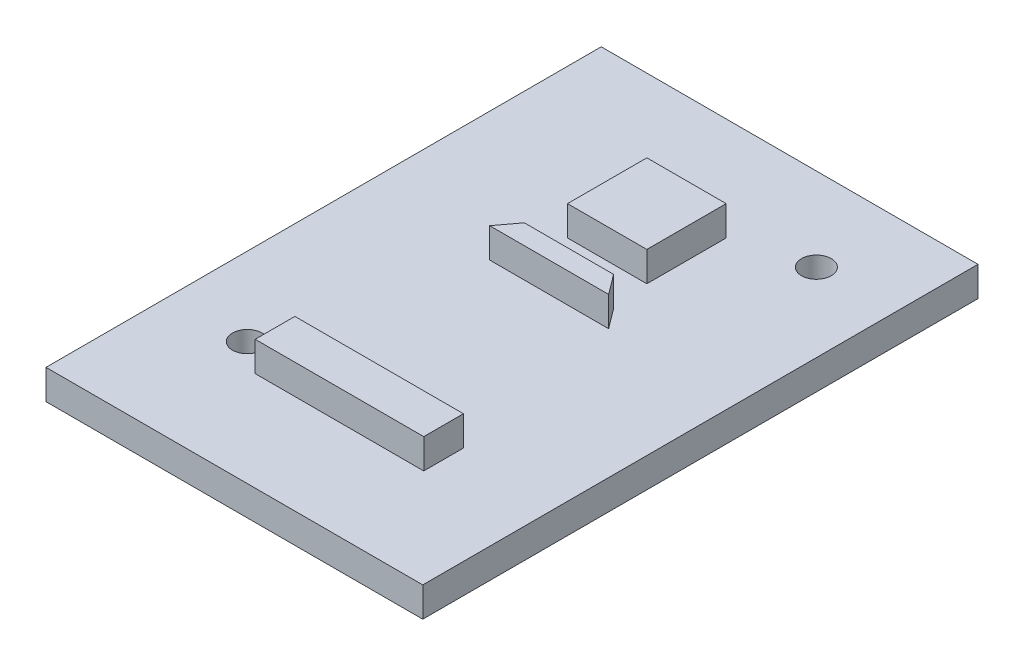
ISO-10303-21;
HEADER;
FILE_DESCRIPTION(('STEP AP214'),'2;1');
FILE_NAME('part.step','',(''),(''),'','','');
FILE_SCHEMA(('AUTOMOTIVE_DESIGN { 1 0 10303 214 1 1 1 1 }'));
ENDSEC;
DATA;
#1=APPLICATION_CONTEXT('core data for automotive mechanical design processes');
#2=APPLICATION_PROTOCOL_DEFINITION('international standard','automotive_design',2000,#1);
#3=PRODUCT_CONTEXT('',#1,'mechanical');
#4=PRODUCT('Part','Part','',(#3));
#5=PRODUCT_RELATED_PRODUCT_CATEGORY('part','',(#4));
#6=PRODUCT_DEFINITION_FORMATION('','',#4);
#7=PRODUCT_DEFINITION_CONTEXT('part definition',#1,'design');
#8=PRODUCT_DEFINITION('design','',#6,#7);
#9=PRODUCT_DEFINITION_SHAPE('','',#8);
#10=(LENGTH_UNIT() NAMED_UNIT(*) SI_UNIT(.MILLI.,.METRE.));
#11=(NAMED_UNIT(*) PLANE_ANGLE_UNIT() SI_UNIT($,.RADIAN.));
#12=(NAMED_UNIT(*) SI_UNIT($,.STERADIAN.) SOLID_ANGLE_UNIT());
#13=UNCERTAINTY_MEASURE_WITH_UNIT(LENGTH_MEASURE(1.E-05),#10,'distance_accuracy_value','');
#14=(GEOMETRIC_REPRESENTATION_CONTEXT(3) GLOBAL_UNCERTAINTY_ASSIGNED_CONTEXT((#13)) GLOBAL_UNIT_ASSIGNED_CONTEXT((#10,
#11,#12)) REPRESENTATION_CONTEXT('',''));
#15=CARTESIAN_POINT('',(0.,0.,0.));
#16=DIRECTION('',(0.,0.,1.));
#17=DIRECTION('',(1.,0.,0.));
#18=AXIS2_PLACEMENT_3D('',#15,#16,#17);
#19=CARTESIAN_POINT('',(0.,1.5,0.));
#20=DIRECTION('',(0.,-1.,0.));
#21=DIRECTION('',(0.,0.,-1.));
#22=AXIS2_PLACEMENT_3D('',#19,#20,#21);
#23=PLANE('',#22);
#24=DIRECTION('',(1.,0.,0.));
#25=VECTOR('',#24,1.);
#26=CARTESIAN_POINT('',(0.,1.5,0.));
#27=LINE('',#26,#25);
#28=CARTESIAN_POINT('',(2.8,1.5,0.));
#29=VERTEX_POINT('',#28);
#30=CARTESIAN_POINT('',(11.3,1.5,0.));
#31=VERTEX_POINT('',#30);
#32=EDGE_CURVE('E175',#29,#31,#27,.T.);
#33=ORIENTED_EDGE('',*,*,#32,.F.);
#34=DIRECTION('',(0.,0.,1.));
#35=VECTOR('',#34,1.);
#36=CARTESIAN_POINT('',(2.8,1.5,0.));
#37=LINE('',#36,#35);
#38=CARTESIAN_POINT('',(2.8,1.5,-2.));
#39=VERTEX_POINT('',#38);
#40=EDGE_CURVE('E47',#39,#29,#37,.T.);
#41=ORIENTED_EDGE('',*,*,#40,.F.);
#42=DIRECTION('',(-1.,0.,0.));
#43=VECTOR('',#42,1.);
#44=CARTESIAN_POINT('',(2.8,1.5,-2.));
#45=LINE('',#44,#43);
#46=CARTESIAN_POINT('',(11.3,1.5,-2.));
#47=VERTEX_POINT('',#46);
#48=EDGE_CURVE('E51',#47,#39,#45,.T.);
#49=ORIENTED_EDGE('',*,*,#48,.F.);
#50=DIRECTION('',(0.,0.,-1.));
#51=VECTOR('',#50,1.);
#52=CARTESIAN_POINT('',(11.3,1.5,0.));
#53=LINE('',#52,#51);
#54=EDGE_CURVE('E199',#31,#47,#53,.T.);
#55=ORIENTED_EDGE('',*,*,#54,.F.);
#56=EDGE_LOOP('',(#33,#41,#49,#55));
#57=FACE_BOUND('',#56,.T.);
#58=DIRECTION('',(-0.6,0.,0.8));
#59=VECTOR('',#58,1.);
#60=CARTESIAN_POINT('',(4.5,1.5,-11.8731868600742));
#61=LINE('',#60,#59);
#62=CARTESIAN_POINT('',(4.5,1.5,-11.8731868600742));
#63=VERTEX_POINT('',#62);
#64=CARTESIAN_POINT('',(3.75,1.5,-10.8731868600742));
#65=VERTEX_POINT('',#64);
#66=EDGE_CURVE('E223',#63,#65,#61,.T.);
#67=ORIENTED_EDGE('',*,*,#66,.F.);
#68=DIRECTION('',(-1.,0.,0.));
#69=VECTOR('',#68,1.);
#70=CARTESIAN_POINT('',(4.5,1.5,-11.8731868600742));
#71=LINE('',#70,#69);
#72=CARTESIAN_POINT('',(9.,1.5,-11.8731868600742));
#73=VERTEX_POINT('',#72);
#74=EDGE_CURVE('E230',#73,#63,#71,.T.);
#75=ORIENTED_EDGE('',*,*,#74,.F.);
#76=DIRECTION('',(-0.6,0.,-0.8));
#77=VECTOR('',#76,1.);
#78=CARTESIAN_POINT('',(9.,1.5,-11.8731868600742));
#79=LINE('',#78,#77);
#80=CARTESIAN_POINT('',(9.75,1.5,-10.8731868600742));
#81=VERTEX_POINT('',#80);
#82=EDGE_CURVE('E242',#81,#73,#79,.T.);
#83=ORIENTED_EDGE('',*,*,#82,.F.);
#84=DIRECTION('',(1.,0.,0.));
#85=VECTOR('',#84,1.);
#86=CARTESIAN_POINT('',(3.75,1.5,-10.8731868600742));
#87=LINE('',#86,#85);
#88=EDGE_CURVE('E239',#65,#81,#87,.T.);
#89=ORIENTED_EDGE('',*,*,#88,.F.);
#90=EDGE_LOOP('',(#67,#75,#83,#89));
#91=FACE_BOUND('',#90,.T.);
#92=DIRECTION('',(0.,0.,1.));
#93=VECTOR('',#92,1.);
#94=CARTESIAN_POINT('',(4.75,1.5,-17.8));
#95=LINE('',#94,#93);
#96=CARTESIAN_POINT('',(4.75,1.5,-17.8));
#97=VERTEX_POINT('',#96);
#98=CARTESIAN_POINT('',(4.75,1.5,-13.8));
#99=VERTEX_POINT('',#98);
#100=EDGE_CURVE('E258',#97,#99,#95,.T.);
#101=ORIENTED_EDGE('',*,*,#100,.F.);
#102=DIRECTION('',(-1.,0.,0.));
#103=VECTOR('',#102,1.);
#104=CARTESIAN_POINT('',(4.75,1.5,-17.8));
#105=LINE('',#104,#103);
#106=CARTESIAN_POINT('',(8.75,1.5,-17.8));
#107=VERTEX_POINT('',#106);
#108=EDGE_CURVE('E263',#107,#97,#105,.T.);
#109=ORIENTED_EDGE('',*,*,#108,.F.);
#110=DIRECTION('',(0.,0.,-1.));
#111=VECTOR('',#110,1.);
#112=CARTESIAN_POINT('',(8.75,1.5,-17.8));
#113=LINE('',#112,#111);
#114=CARTESIAN_POINT('',(8.75,1.5,-13.8));
#115=VERTEX_POINT('',#114);
#116=EDGE_CURVE('E275',#115,#107,#113,.T.);
#117=ORIENTED_EDGE('',*,*,#116,.F.);
#118=DIRECTION('',(1.,0.,0.));
#119=VECTOR('',#118,1.);
#120=CARTESIAN_POINT('',(4.75,1.5,-13.8));
#121=LINE('',#120,#119);
#122=EDGE_CURVE('E272',#99,#115,#121,.T.);
#123=ORIENTED_EDGE('',*,*,#122,.F.);
#124=EDGE_LOOP('',(#101,#109,#117,#123));
#125=FACE_BOUND('',#124,.T.);
#126=CARTESIAN_POINT('',(12.3,1.5,-18.8));
#127=DIRECTION('',(0.,-1.,0.));
#128=DIRECTION('',(0.,0.,-1.));
#129=AXIS2_PLACEMENT_3D('',#126,#127,#128);
#130=CIRCLE('',#129,0.75);
#131=CARTESIAN_POINT('',(12.3,1.5,-19.55));
#132=VERTEX_POINT('',#131);
#133=EDGE_CURVE('E220',#132,#132,#130,.T.);
#134=ORIENTED_EDGE('',*,*,#133,.T.);
#135=EDGE_LOOP('',(#134));
#136=FACE_BOUND('',#135,.T.);
#137=CARTESIAN_POINT('',(1.2,1.5,-1.2));
#138=DIRECTION('',(0.,-1.,0.));
#139=DIRECTION('',(0.,0.,-1.));
#140=AXIS2_PLACEMENT_3D('',#137,#138,#139);
#141=CIRCLE('',#140,0.75);
#142=CARTESIAN_POINT('',(1.2,1.5,-1.95));
#143=VERTEX_POINT('',#142);
#144=EDGE_CURVE('E214',#143,#143,#141,.T.);
#145=ORIENTED_EDGE('',*,*,#144,.T.);
#146=EDGE_LOOP('',(#145));
#147=FACE_BOUND('',#146,.T.);
#148=DIRECTION('',(0.,0.,1.));
#149=VECTOR('',#148,1.);
#150=CARTESIAN_POINT('',(-2.75,1.5,-23.));
#151=LINE('',#150,#149);
#152=CARTESIAN_POINT('',(-2.75,1.5,-23.));
#153=VERTEX_POINT('',#152);
#154=CARTESIAN_POINT('',(-2.75,1.5,5.));
#155=VERTEX_POINT('',#154);
#156=EDGE_CURVE('E179',#153,#155,#151,.T.);
#157=ORIENTED_EDGE('',*,*,#156,.T.);
#158=DIRECTION('',(1.,0.,0.));
#159=VECTOR('',#158,1.);
#160=CARTESIAN_POINT('',(-2.75,1.5,5.));
#161=LINE('',#160,#159);
#162=CARTESIAN_POINT('',(16.25,1.5,5.));
#163=VERTEX_POINT('',#162);
#164=EDGE_CURVE('E149',#155,#163,#161,.T.);
#165=ORIENTED_EDGE('',*,*,#164,.T.);
#166=DIRECTION('',(0.,0.,-1.));
#167=VECTOR('',#166,1.);
#168=CARTESIAN_POINT('',(16.25,1.5,-23.));
#169=LINE('',#168,#167);
#170=CARTESIAN_POINT('',(16.25,1.5,-23.));
#171=VERTEX_POINT('',#170);
#172=EDGE_CURVE('E172',#163,#171,#169,.T.);
#173=ORIENTED_EDGE('',*,*,#172,.T.);
#174=DIRECTION('',(-1.,0.,0.));
#175=VECTOR('',#174,1.);
#176=CARTESIAN_POINT('',(-2.75,1.5,-23.));
#177=LINE('',#176,#175);
#178=EDGE_CURVE('E169',#171,#153,#177,.T.);
#179=ORIENTED_EDGE('',*,*,#178,.T.);
#180=EDGE_LOOP('',(#157,#165,#173,#179));
#181=FACE_BOUND('',#180,.T.);
#182=ADVANCED_FACE('F32',(#57,#91,#125,#136,#147,#181),#23,.F.);
#183=CARTESIAN_POINT('',(0.,1.5,0.));
#184=DIRECTION('',(0.,0.,-1.));
#185=DIRECTION('',(-1.,0.,0.));
#186=AXIS2_PLACEMENT_3D('',#183,#184,#185);
#187=PLANE('',#186);
#188=DIRECTION('',(0.,-1.,0.));
#189=VECTOR('',#188,1.);
#190=CARTESIAN_POINT('',(2.8,3.,0.));
#191=LINE('',#190,#189);
#192=CARTESIAN_POINT('',(2.8,3.,0.));
#193=VERTEX_POINT('',#192);
#194=EDGE_CURVE('E210',#193,#29,#191,.T.);
#195=ORIENTED_EDGE('',*,*,#194,.T.);
#196=ORIENTED_EDGE('',*,*,#32,.T.);
#197=DIRECTION('',(0.,-1.,0.));
#198=VECTOR('',#197,1.);
#199=CARTESIAN_POINT('',(11.3,3.,0.));
#200=LINE('',#199,#198);
#201=CARTESIAN_POINT('',(11.3,3.,0.));
#202=VERTEX_POINT('',#201);
#203=EDGE_CURVE('E207',#202,#31,#200,.T.);
#204=ORIENTED_EDGE('',*,*,#203,.F.);
#205=DIRECTION('',(1.,0.,0.));
#206=VECTOR('',#205,1.);
#207=CARTESIAN_POINT('',(2.8,3.,0.));
#208=LINE('',#207,#206);
#209=EDGE_CURVE('E191',#193,#202,#208,.T.);
#210=ORIENTED_EDGE('',*,*,#209,.F.);
#211=EDGE_LOOP('',(#195,#196,#204,#210));
#212=FACE_BOUND('',#211,.T.);
#213=ADVANCED_FACE('F34',(#212),#187,.F.);
#214=CARTESIAN_POINT('',(0.,0.,0.));
#215=DIRECTION('',(0.,-1.,0.));
#216=DIRECTION('',(0.,0.,-1.));
#217=AXIS2_PLACEMENT_3D('',#214,#215,#216);
#218=PLANE('',#217);
#219=CARTESIAN_POINT('',(1.2,0.,-1.2));
#220=DIRECTION('',(0.,-1.,0.));
#221=DIRECTION('',(0.,0.,-1.));
#222=AXIS2_PLACEMENT_3D('',#219,#220,#221);
#223=CIRCLE('',#222,0.75);
#224=CARTESIAN_POINT('',(1.2,0.,-1.95));
#225=VERTEX_POINT('',#224);
#226=EDGE_CURVE('E213',#225,#225,#223,.T.);
#227=ORIENTED_EDGE('',*,*,#226,.F.);
#228=EDGE_LOOP('',(#227));
#229=FACE_BOUND('',#228,.T.);
#230=CARTESIAN_POINT('',(12.3,0.,-18.8));
#231=DIRECTION('',(0.,-1.,0.));
#232=DIRECTION('',(0.,0.,-1.));
#233=AXIS2_PLACEMENT_3D('',#230,#231,#232);
#234=CIRCLE('',#233,0.75);
#235=CARTESIAN_POINT('',(12.3,0.,-19.55));
#236=VERTEX_POINT('',#235);
#237=EDGE_CURVE('E217',#236,#236,#234,.T.);
#238=ORIENTED_EDGE('',*,*,#237,.F.);
#239=EDGE_LOOP('',(#238));
#240=FACE_BOUND('',#239,.T.);
#241=DIRECTION('',(0.,0.,1.));
#242=VECTOR('',#241,1.);
#243=CARTESIAN_POINT('',(-2.75,0.,-23.));
#244=LINE('',#243,#242);
#245=CARTESIAN_POINT('',(-2.75,0.,-23.));
#246=VERTEX_POINT('',#245);
#247=CARTESIAN_POINT('',(-2.75,0.,5.));
#248=VERTEX_POINT('',#247);
#249=EDGE_CURVE('E162',#246,#248,#244,.T.);
#250=ORIENTED_EDGE('',*,*,#249,.F.);
#251=DIRECTION('',(-1.,0.,0.));
#252=VECTOR('',#251,1.);
#253=CARTESIAN_POINT('',(-2.75,0.,-23.));
#254=LINE('',#253,#252);
#255=CARTESIAN_POINT('',(16.25,0.,-23.));
#256=VERTEX_POINT('',#255);
#257=EDGE_CURVE('E155',#256,#246,#254,.T.);
#258=ORIENTED_EDGE('',*,*,#257,.F.);
#259=DIRECTION('',(0.,0.,-1.));
#260=VECTOR('',#259,1.);
#261=CARTESIAN_POINT('',(16.25,0.,-23.));
#262=LINE('',#261,#260);
#263=CARTESIAN_POINT('',(16.25,0.,5.));
#264=VERTEX_POINT('',#263);
#265=EDGE_CURVE('E165',#264,#256,#262,.T.);
#266=ORIENTED_EDGE('',*,*,#265,.F.);
#267=DIRECTION('',(1.,0.,0.));
#268=VECTOR('',#267,1.);
#269=CARTESIAN_POINT('',(-2.75,0.,5.));
#270=LINE('',#269,#268);
#271=EDGE_CURVE('E147',#248,#264,#270,.T.);
#272=ORIENTED_EDGE('',*,*,#271,.F.);
#273=EDGE_LOOP('',(#250,#258,#266,#272));
#274=FACE_BOUND('',#273,.T.);
#275=ADVANCED_FACE('F160',(#229,#240,#274),#218,.T.);
#276=CARTESIAN_POINT('',(4.75,3.,-17.8));
#277=DIRECTION('',(1.,0.,0.));
#278=DIRECTION('',(0.,0.,-1.));
#279=AXIS2_PLACEMENT_3D('',#276,#277,#278);
#280=PLANE('',#279);
#281=ORIENTED_EDGE('',*,*,#100,.T.);
#282=DIRECTION('',(0.,-1.,0.));
#283=VECTOR('',#282,1.);
#284=CARTESIAN_POINT('',(4.75,3.,-13.8));
#285=LINE('',#284,#283);
#286=CARTESIAN_POINT('',(4.75,3.,-13.8));
#287=VERTEX_POINT('',#286);
#288=EDGE_CURVE('E11',#287,#99,#285,.T.);
#289=ORIENTED_EDGE('',*,*,#288,.F.);
#290=DIRECTION('',(0.,0.,1.));
#291=VECTOR('',#290,1.);
#292=CARTESIAN_POINT('',(4.75,3.,-17.8));
#293=LINE('',#292,#291);
#294=CARTESIAN_POINT('',(4.75,3.,-17.8));
#295=VERTEX_POINT('',#294);
#296=EDGE_CURVE('E259',#295,#287,#293,.T.);
#297=ORIENTED_EDGE('',*,*,#296,.F.);
#298=DIRECTION('',(0.,-1.,0.));
#299=VECTOR('',#298,1.);
#300=CARTESIAN_POINT('',(4.75,3.,-17.8));
#301=LINE('',#300,#299);
#302=EDGE_CURVE('E269',#295,#97,#301,.T.);
#303=ORIENTED_EDGE('',*,*,#302,.T.);
#304=EDGE_LOOP('',(#281,#289,#297,#303));
#305=FACE_BOUND('',#304,.T.);
#306=ADVANCED_FACE('F301',(#305),#280,.F.);
#307=CARTESIAN_POINT('',(4.75,3.,-13.8));
#308=DIRECTION('',(0.,0.,-1.));
#309=DIRECTION('',(-1.,0.,0.));
#310=AXIS2_PLACEMENT_3D('',#307,#308,#309);
#311=PLANE('',#310);
#312=ORIENTED_EDGE('',*,*,#122,.T.);
#313=DIRECTION('',(0.,-1.,0.));
#314=VECTOR('',#313,1.);
#315=CARTESIAN_POINT('',(8.75,3.,-13.8));
#316=LINE('',#315,#314);
#317=CARTESIAN_POINT('',(8.75,3.,-13.8));
#318=VERTEX_POINT('',#317);
#319=EDGE_CURVE('E40',#318,#115,#316,.T.);
#320=ORIENTED_EDGE('',*,*,#319,.F.);
#321=DIRECTION('',(1.,0.,0.));
#322=VECTOR('',#321,1.);
#323=CARTESIAN_POINT('',(4.75,3.,-13.8));
#324=LINE('',#323,#322);
#325=EDGE_CURVE('E262',#287,#318,#324,.T.);
#326=ORIENTED_EDGE('',*,*,#325,.F.);
#327=ORIENTED_EDGE('',*,*,#288,.T.);
#328=EDGE_LOOP('',(#312,#320,#326,#327));
#329=FACE_BOUND('',#328,.T.);
#330=ADVANCED_FACE('F291',(#329),#311,.F.);
#331=CARTESIAN_POINT('',(8.75,3.,-17.8));
#332=DIRECTION('',(-1.,0.,0.));
#333=DIRECTION('',(0.,0.,1.));
#334=AXIS2_PLACEMENT_3D('',#331,#332,#333);
#335=PLANE('',#334);
#336=ORIENTED_EDGE('',*,*,#116,.T.);
#337=DIRECTION('',(0.,-1.,0.));
#338=VECTOR('',#337,1.);
#339=CARTESIAN_POINT('',(8.75,3.,-17.8));
#340=LINE('',#339,#338);
#341=CARTESIAN_POINT('',(8.75,3.,-17.8));
#342=VERTEX_POINT('',#341);
#343=EDGE_CURVE('E282',#342,#107,#340,.T.);
#344=ORIENTED_EDGE('',*,*,#343,.F.);
#345=DIRECTION('',(0.,0.,-1.));
#346=VECTOR('',#345,1.);
#347=CARTESIAN_POINT('',(8.75,3.,-17.8));
#348=LINE('',#347,#346);
#349=EDGE_CURVE('E265',#318,#342,#348,.T.);
#350=ORIENTED_EDGE('',*,*,#349,.F.);
#351=ORIENTED_EDGE('',*,*,#319,.T.);
#352=EDGE_LOOP('',(#336,#344,#350,#351));
#353=FACE_BOUND('',#352,.T.);
#354=ADVANCED_FACE('F288',(#353),#335,.F.);
#355=CARTESIAN_POINT('',(4.75,3.,-17.8));
#356=DIRECTION('',(0.,0.,1.));
#357=DIRECTION('',(1.,0.,0.));
#358=AXIS2_PLACEMENT_3D('',#355,#356,#357);
#359=PLANE('',#358);
#360=ORIENTED_EDGE('',*,*,#108,.T.);
#361=ORIENTED_EDGE('',*,*,#302,.F.);
#362=DIRECTION('',(-1.,0.,0.));
#363=VECTOR('',#362,1.);
#364=CARTESIAN_POINT('',(4.75,3.,-17.8));
#365=LINE('',#364,#363);
#366=EDGE_CURVE('E267',#342,#295,#365,.T.);
#367=ORIENTED_EDGE('',*,*,#366,.F.);
#368=ORIENTED_EDGE('',*,*,#343,.T.);
#369=EDGE_LOOP('',(#360,#361,#367,#368));
#370=FACE_BOUND('',#369,.T.);
#371=ADVANCED_FACE('F297',(#370),#359,.F.);
#372=CARTESIAN_POINT('',(0.,3.,0.));
#373=DIRECTION('',(0.,1.,0.));
#374=DIRECTION('',(0.,0.,1.));
#375=AXIS2_PLACEMENT_3D('',#372,#373,#374);
#376=PLANE('',#375);
#377=ORIENTED_EDGE('',*,*,#296,.T.);
#378=ORIENTED_EDGE('',*,*,#325,.T.);
#379=ORIENTED_EDGE('',*,*,#349,.T.);
#380=ORIENTED_EDGE('',*,*,#366,.T.);
#381=EDGE_LOOP('',(#377,#378,#379,#380));
#382=FACE_BOUND('',#381,.T.);
#383=ADVANCED_FACE('F303',(#382),#376,.T.);
#384=CARTESIAN_POINT('',(4.5,3.,-11.8731868600742));
#385=DIRECTION('',(0.8,0.,0.6));
#386=DIRECTION('',(0.6,0.,-0.8));
#387=AXIS2_PLACEMENT_3D('',#384,#385,#386);
#388=PLANE('',#387);
#389=ORIENTED_EDGE('',*,*,#66,.T.);
#390=DIRECTION('',(0.,-1.,0.));
#391=VECTOR('',#390,1.);
#392=CARTESIAN_POINT('',(3.75,3.,-10.8731868600742));
#393=LINE('',#392,#391);
#394=CARTESIAN_POINT('',(3.75,3.,-10.8731868600742));
#395=VERTEX_POINT('',#394);
#396=EDGE_CURVE('E255',#395,#65,#393,.T.);
#397=ORIENTED_EDGE('',*,*,#396,.F.);
#398=DIRECTION('',(-0.6,0.,0.8));
#399=VECTOR('',#398,1.);
#400=CARTESIAN_POINT('',(4.5,3.,-11.8731868600742));
#401=LINE('',#400,#399);
#402=CARTESIAN_POINT('',(4.5,3.,-11.8731868600742));
#403=VERTEX_POINT('',#402);
#404=EDGE_CURVE('E226',#403,#395,#401,.T.);
#405=ORIENTED_EDGE('',*,*,#404,.F.);
#406=DIRECTION('',(0.,-1.,0.));
#407=VECTOR('',#406,1.);
#408=CARTESIAN_POINT('',(4.5,3.,-11.8731868600742));
#409=LINE('',#408,#407);
#410=EDGE_CURVE('E236',#403,#63,#409,.T.);
#411=ORIENTED_EDGE('',*,*,#410,.T.);
#412=EDGE_LOOP('',(#389,#397,#405,#411));
#413=FACE_BOUND('',#412,.T.);
#414=ADVANCED_FACE('F305',(#413),#388,.F.);
#415=CARTESIAN_POINT('',(3.75,3.,-10.8731868600742));
#416=DIRECTION('',(0.,0.,-1.));
#417=DIRECTION('',(-1.,0.,0.));
#418=AXIS2_PLACEMENT_3D('',#415,#416,#417);
#419=PLANE('',#418);
#420=ORIENTED_EDGE('',*,*,#88,.T.);
#421=DIRECTION('',(0.,-1.,0.));
#422=VECTOR('',#421,1.);
#423=CARTESIAN_POINT('',(9.75,3.,-10.8731868600742));
#424=LINE('',#423,#422);
#425=CARTESIAN_POINT('',(9.75,3.,-10.8731868600742));
#426=VERTEX_POINT('',#425);
#427=EDGE_CURVE('E252',#426,#81,#424,.T.);
#428=ORIENTED_EDGE('',*,*,#427,.F.);
#429=DIRECTION('',(1.,0.,0.));
#430=VECTOR('',#429,1.);
#431=CARTESIAN_POINT('',(3.75,3.,-10.8731868600742));
#432=LINE('',#431,#430);
#433=EDGE_CURVE('E229',#395,#426,#432,.T.);
#434=ORIENTED_EDGE('',*,*,#433,.F.);
#435=ORIENTED_EDGE('',*,*,#396,.T.);
#436=EDGE_LOOP('',(#420,#428,#434,#435));
#437=FACE_BOUND('',#436,.T.);
#438=ADVANCED_FACE('F311',(#437),#419,.F.);
#439=CARTESIAN_POINT('',(9.,3.,-11.8731868600742));
#440=DIRECTION('',(-0.8,0.,0.6));
#441=DIRECTION('',(0.6,0.,0.8));
#442=AXIS2_PLACEMENT_3D('',#439,#440,#441);
#443=PLANE('',#442);
#444=ORIENTED_EDGE('',*,*,#82,.T.);
#445=DIRECTION('',(0.,-1.,0.));
#446=VECTOR('',#445,1.);
#447=CARTESIAN_POINT('',(9.,3.,-11.8731868600742));
#448=LINE('',#447,#446);
#449=CARTESIAN_POINT('',(9.,3.,-11.8731868600742));
#450=VERTEX_POINT('',#449);
#451=EDGE_CURVE('E249',#450,#73,#448,.T.);
#452=ORIENTED_EDGE('',*,*,#451,.F.);
#453=DIRECTION('',(-0.6,0.,-0.8));
#454=VECTOR('',#453,1.);
#455=CARTESIAN_POINT('',(9.,3.,-11.8731868600742));
#456=LINE('',#455,#454);
#457=EDGE_CURVE('E232',#426,#450,#456,.T.);
#458=ORIENTED_EDGE('',*,*,#457,.F.);
#459=ORIENTED_EDGE('',*,*,#427,.T.);
#460=EDGE_LOOP('',(#444,#452,#458,#459));
#461=FACE_BOUND('',#460,.T.);
#462=ADVANCED_FACE('F354',(#461),#443,.F.);
#463=CARTESIAN_POINT('',(4.5,3.,-11.8731868600742));
#464=DIRECTION('',(0.,0.,1.));
#465=DIRECTION('',(1.,0.,0.));
#466=AXIS2_PLACEMENT_3D('',#463,#464,#465);
#467=PLANE('',#466);
#468=ORIENTED_EDGE('',*,*,#74,.T.);
#469=ORIENTED_EDGE('',*,*,#410,.F.);
#470=DIRECTION('',(-1.,0.,0.));
#471=VECTOR('',#470,1.);
#472=CARTESIAN_POINT('',(4.5,3.,-11.8731868600742));
#473=LINE('',#472,#471);
#474=EDGE_CURVE('E234',#450,#403,#473,.T.);
#475=ORIENTED_EDGE('',*,*,#474,.F.);
#476=ORIENTED_EDGE('',*,*,#451,.T.);
#477=EDGE_LOOP('',(#468,#469,#475,#476));
#478=FACE_BOUND('',#477,.T.);
#479=ADVANCED_FACE('F346',(#478),#467,.F.);
#480=CARTESIAN_POINT('',(0.,3.,0.));
#481=DIRECTION('',(0.,1.,0.));
#482=DIRECTION('',(0.,0.,1.));
#483=AXIS2_PLACEMENT_3D('',#480,#481,#482);
#484=PLANE('',#483);
#485=ORIENTED_EDGE('',*,*,#404,.T.);
#486=ORIENTED_EDGE('',*,*,#433,.T.);
#487=ORIENTED_EDGE('',*,*,#457,.T.);
#488=ORIENTED_EDGE('',*,*,#474,.T.);
#489=EDGE_LOOP('',(#485,#486,#487,#488));
#490=FACE_BOUND('',#489,.T.);
#491=ADVANCED_FACE('F336',(#490),#484,.T.);
#492=CARTESIAN_POINT('',(12.3,1.5,-18.8));
#493=DIRECTION('',(0.,-1.,0.));
#494=DIRECTION('',(0.,0.,-1.));
#495=AXIS2_PLACEMENT_3D('',#492,#493,#494);
#496=CYLINDRICAL_SURFACE('',#495,0.75);
#497=ORIENTED_EDGE('',*,*,#133,.F.);
#498=EDGE_LOOP('',(#497));
#499=FACE_BOUND('',#498,.T.);
#500=ORIENTED_EDGE('',*,*,#237,.T.);
#501=EDGE_LOOP('',(#500));
#502=FACE_BOUND('',#501,.T.);
#503=ADVANCED_FACE('F333',(#499,#502),#496,.F.);
#504=CARTESIAN_POINT('',(1.2,1.5,-1.2));
#505=DIRECTION('',(0.,-1.,0.));
#506=DIRECTION('',(0.,0.,-1.));
#507=AXIS2_PLACEMENT_3D('',#504,#505,#506);
#508=CYLINDRICAL_SURFACE('',#507,0.75);
#509=ORIENTED_EDGE('',*,*,#144,.F.);
#510=EDGE_LOOP('',(#509));
#511=FACE_BOUND('',#510,.T.);
#512=ORIENTED_EDGE('',*,*,#226,.T.);
#513=EDGE_LOOP('',(#512));
#514=FACE_BOUND('',#513,.T.);
#515=ADVANCED_FACE('F335',(#511,#514),#508,.F.);
#516=CARTESIAN_POINT('',(2.8,3.,0.));
#517=DIRECTION('',(1.,0.,0.));
#518=DIRECTION('',(0.,0.,-1.));
#519=AXIS2_PLACEMENT_3D('',#516,#517,#518);
#520=PLANE('',#519);
#521=ORIENTED_EDGE('',*,*,#40,.T.);
#522=ORIENTED_EDGE('',*,*,#194,.F.);
#523=DIRECTION('',(0.,0.,1.));
#524=VECTOR('',#523,1.);
#525=CARTESIAN_POINT('',(2.8,3.,0.));
#526=LINE('',#525,#524);
#527=CARTESIAN_POINT('',(2.8,3.,-2.));
#528=VERTEX_POINT('',#527);
#529=EDGE_CURVE('E188',#528,#193,#526,.T.);
#530=ORIENTED_EDGE('',*,*,#529,.F.);
#531=DIRECTION('',(0.,-1.,0.));
#532=VECTOR('',#531,1.);
#533=CARTESIAN_POINT('',(2.8,3.,-2.));
#534=LINE('',#533,#532);
#535=EDGE_CURVE('E197',#528,#39,#534,.T.);
#536=ORIENTED_EDGE('',*,*,#535,.T.);
#537=EDGE_LOOP('',(#521,#522,#530,#536));
#538=FACE_BOUND('',#537,.T.);
#539=ADVANCED_FACE('F343',(#538),#520,.F.);
#540=CARTESIAN_POINT('',(11.3,3.,0.));
#541=DIRECTION('',(-1.,0.,0.));
#542=DIRECTION('',(0.,0.,1.));
#543=AXIS2_PLACEMENT_3D('',#540,#541,#542);
#544=PLANE('',#543);
#545=ORIENTED_EDGE('',*,*,#54,.T.);
#546=DIRECTION('',(0.,-1.,0.));
#547=VECTOR('',#546,1.);
#548=CARTESIAN_POINT('',(11.3,3.,-2.));
#549=LINE('',#548,#547);
#550=CARTESIAN_POINT('',(11.3,3.,-2.));
#551=VERTEX_POINT('',#550);
#552=EDGE_CURVE('E204',#551,#47,#549,.T.);
#553=ORIENTED_EDGE('',*,*,#552,.F.);
#554=DIRECTION('',(0.,0.,-1.));
#555=VECTOR('',#554,1.);
#556=CARTESIAN_POINT('',(11.3,3.,0.));
#557=LINE('',#556,#555);
#558=EDGE_CURVE('E193',#202,#551,#557,.T.);
#559=ORIENTED_EDGE('',*,*,#558,.F.);
#560=ORIENTED_EDGE('',*,*,#203,.T.);
#561=EDGE_LOOP('',(#545,#553,#559,#560));
#562=FACE_BOUND('',#561,.T.);
#563=ADVANCED_FACE('F407',(#562),#544,.F.);
#564=CARTESIAN_POINT('',(2.8,3.,-2.));
#565=DIRECTION('',(0.,0.,1.));
#566=DIRECTION('',(1.,0.,0.));
#567=AXIS2_PLACEMENT_3D('',#564,#565,#566);
#568=PLANE('',#567);
#569=ORIENTED_EDGE('',*,*,#48,.T.);
#570=ORIENTED_EDGE('',*,*,#535,.F.);
#571=DIRECTION('',(-1.,0.,0.));
#572=VECTOR('',#571,1.);
#573=CARTESIAN_POINT('',(2.8,3.,-2.));
#574=LINE('',#573,#572);
#575=EDGE_CURVE('E195',#551,#528,#574,.T.);
#576=ORIENTED_EDGE('',*,*,#575,.F.);
#577=ORIENTED_EDGE('',*,*,#552,.T.);
#578=EDGE_LOOP('',(#569,#570,#576,#577));
#579=FACE_BOUND('',#578,.T.);
#580=ADVANCED_FACE('F401',(#579),#568,.F.);
#581=CARTESIAN_POINT('',(0.,3.,0.));
#582=DIRECTION('',(0.,-1.,0.));
#583=DIRECTION('',(0.,0.,-1.));
#584=AXIS2_PLACEMENT_3D('',#581,#582,#583);
#585=PLANE('',#584);
#586=ORIENTED_EDGE('',*,*,#529,.T.);
#587=ORIENTED_EDGE('',*,*,#209,.T.);
#588=ORIENTED_EDGE('',*,*,#558,.T.);
#589=ORIENTED_EDGE('',*,*,#575,.T.);
#590=EDGE_LOOP('',(#586,#587,#588,#589));
#591=FACE_BOUND('',#590,.T.);
#592=ADVANCED_FACE('F406',(#591),#585,.F.);
#593=CARTESIAN_POINT('',(-2.75,0.,-23.));
#594=DIRECTION('',(-1.,0.,0.));
#595=DIRECTION('',(0.,0.,1.));
#596=AXIS2_PLACEMENT_3D('',#593,#594,#595);
#597=PLANE('',#596);
#598=ORIENTED_EDGE('',*,*,#156,.F.);
#599=DIRECTION('',(0.,1.,0.));
#600=VECTOR('',#599,1.);
#601=CARTESIAN_POINT('',(-2.75,0.,-23.));
#602=LINE('',#601,#600);
#603=EDGE_CURVE('E168',#246,#153,#602,.T.);
#604=ORIENTED_EDGE('',*,*,#603,.F.);
#605=ORIENTED_EDGE('',*,*,#249,.T.);
#606=DIRECTION('',(0.,1.,0.));
#607=VECTOR('',#606,1.);
#608=CARTESIAN_POINT('',(-2.75,0.,5.));
#609=LINE('',#608,#607);
#610=EDGE_CURVE('E144',#248,#155,#609,.T.);
#611=ORIENTED_EDGE('',*,*,#610,.T.);
#612=EDGE_LOOP('',(#598,#604,#605,#611));
#613=FACE_BOUND('',#612,.T.);
#614=ADVANCED_FACE('F167',(#613),#597,.T.);
#615=CARTESIAN_POINT('',(-2.75,0.,-23.));
#616=DIRECTION('',(0.,0.,-1.));
#617=DIRECTION('',(-1.,0.,0.));
#618=AXIS2_PLACEMENT_3D('',#615,#616,#617);
#619=PLANE('',#618);
#620=ORIENTED_EDGE('',*,*,#178,.F.);
#621=DIRECTION('',(0.,1.,0.));
#622=VECTOR('',#621,1.);
#623=CARTESIAN_POINT('',(16.25,0.,-23.));
#624=LINE('',#623,#622);
#625=EDGE_CURVE('E185',#256,#171,#624,.T.);
#626=ORIENTED_EDGE('',*,*,#625,.F.);
#627=ORIENTED_EDGE('',*,*,#257,.T.);
#628=ORIENTED_EDGE('',*,*,#603,.T.);
#629=EDGE_LOOP('',(#620,#626,#627,#628));
#630=FACE_BOUND('',#629,.T.);
#631=ADVANCED_FACE('F458',(#630),#619,.T.);
#632=CARTESIAN_POINT('',(16.25,0.,-23.));
#633=DIRECTION('',(1.,0.,0.));
#634=DIRECTION('',(0.,0.,-1.));
#635=AXIS2_PLACEMENT_3D('',#632,#633,#634);
#636=PLANE('',#635);
#637=ORIENTED_EDGE('',*,*,#172,.F.);
#638=DIRECTION('',(0.,1.,0.));
#639=VECTOR('',#638,1.);
#640=CARTESIAN_POINT('',(16.25,0.,5.));
#641=LINE('',#640,#639);
#642=EDGE_CURVE('E154',#264,#163,#641,.T.);
#643=ORIENTED_EDGE('',*,*,#642,.F.);
#644=ORIENTED_EDGE('',*,*,#265,.T.);
#645=ORIENTED_EDGE('',*,*,#625,.T.);
#646=EDGE_LOOP('',(#637,#643,#644,#645));
#647=FACE_BOUND('',#646,.T.);
#648=ADVANCED_FACE('F467',(#647),#636,.T.);
#649=CARTESIAN_POINT('',(-2.75,0.,5.));
#650=DIRECTION('',(0.,0.,1.));
#651=DIRECTION('',(1.,0.,0.));
#652=AXIS2_PLACEMENT_3D('',#649,#650,#651);
#653=PLANE('',#652);
#654=ORIENTED_EDGE('',*,*,#164,.F.);
#655=ORIENTED_EDGE('',*,*,#610,.F.);
#656=ORIENTED_EDGE('',*,*,#271,.T.);
#657=ORIENTED_EDGE('',*,*,#642,.T.);
#658=EDGE_LOOP('',(#654,#655,#656,#657));
#659=FACE_BOUND('',#658,.T.);
#660=ADVANCED_FACE('F146',(#659),#653,.T.);
#661=CLOSED_SHELL('',(#182,#213,#275,#306,#330,#354,#371,#383,#414,#438,#462,#479,#491,#503,
#515,#539,#563,#580,#592,#614,#631,#648,#660));
#662=MANIFOLD_SOLID_BREP('B2',#661);
#663=ADVANCED_BREP_SHAPE_REPRESENTATION('',(#18,#662),#14);
#664=SHAPE_DEFINITION_REPRESENTATION(#9,#663);
ENDSEC;
END-ISO-10303-21;
